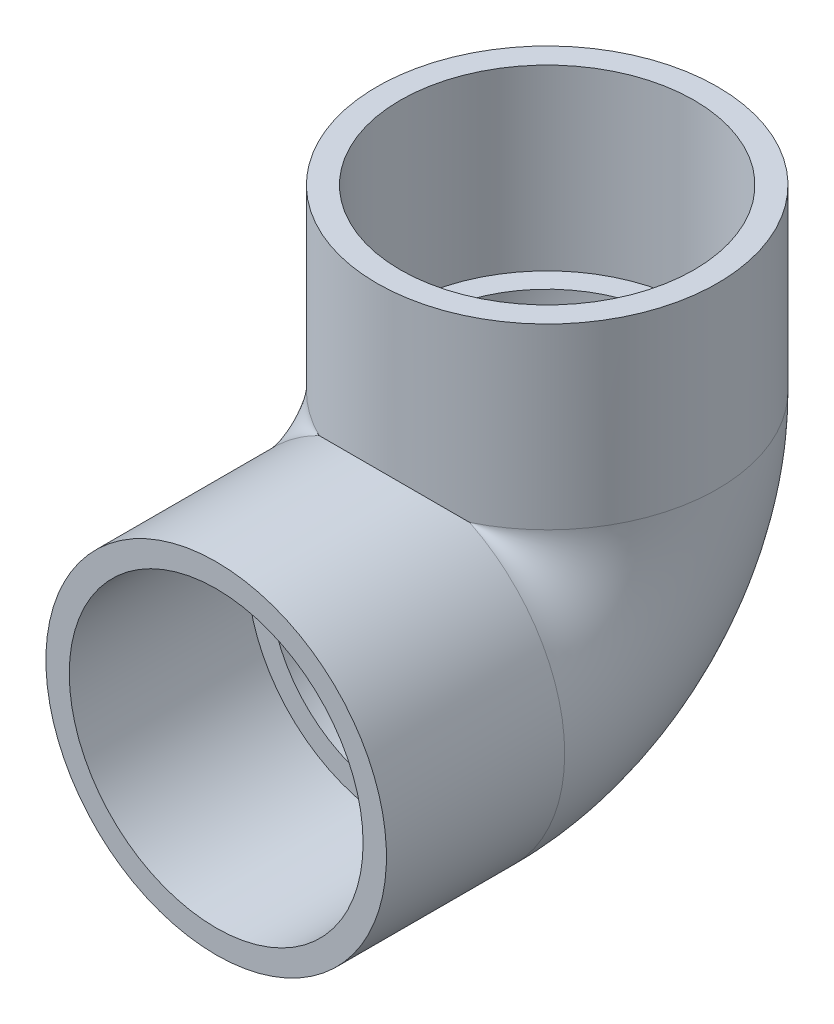
ISO-10303-21;
HEADER;
FILE_DESCRIPTION(('STEP AP214'),'2;1');
FILE_NAME('part.step','',(''),(''),'','','');
FILE_SCHEMA(('AUTOMOTIVE_DESIGN { 1 0 10303 214 1 1 1 1 }'));
ENDSEC;
DATA;
#1=APPLICATION_CONTEXT('core data for automotive mechanical design processes');
#2=APPLICATION_PROTOCOL_DEFINITION('international standard','automotive_design',2000,#1);
#3=PRODUCT_CONTEXT('',#1,'mechanical');
#4=PRODUCT('Part','Part','',(#3));
#5=PRODUCT_RELATED_PRODUCT_CATEGORY('part','',(#4));
#6=PRODUCT_DEFINITION_FORMATION('','',#4);
#7=PRODUCT_DEFINITION_CONTEXT('part definition',#1,'design');
#8=PRODUCT_DEFINITION('design','',#6,#7);
#9=PRODUCT_DEFINITION_SHAPE('','',#8);
#10=(LENGTH_UNIT() NAMED_UNIT(*) SI_UNIT(.MILLI.,.METRE.));
#11=(NAMED_UNIT(*) PLANE_ANGLE_UNIT() SI_UNIT($,.RADIAN.));
#12=(NAMED_UNIT(*) SI_UNIT($,.STERADIAN.) SOLID_ANGLE_UNIT());
#13=UNCERTAINTY_MEASURE_WITH_UNIT(LENGTH_MEASURE(1.E-05),#10,'distance_accuracy_value','');
#14=(GEOMETRIC_REPRESENTATION_CONTEXT(3) GLOBAL_UNCERTAINTY_ASSIGNED_CONTEXT((#13)) GLOBAL_UNIT_ASSIGNED_CONTEXT((#10,
#11,#12)) REPRESENTATION_CONTEXT('',''));
#15=CARTESIAN_POINT('',(0.,0.,0.));
#16=DIRECTION('',(0.,0.,1.));
#17=DIRECTION('',(1.,0.,0.));
#18=AXIS2_PLACEMENT_3D('',#15,#16,#17);
#19=CARTESIAN_POINT('',(0.,36.6395,82.55));
#20=DIRECTION('',(0.,0.,1.));
#21=DIRECTION('',(0.,-1.,0.));
#22=AXIS2_PLACEMENT_3D('',#19,#20,#21);
#23=PLANE('',#22);
#24=CARTESIAN_POINT('',(0.,0.,82.55));
#25=DIRECTION('',(0.,0.,-1.));
#26=DIRECTION('',(0.,1.,0.));
#27=AXIS2_PLACEMENT_3D('',#24,#25,#26);
#28=CIRCLE('',#27,36.6395);
#29=CARTESIAN_POINT('',(0.,36.6395,82.55));
#30=VERTEX_POINT('',#29);
#31=EDGE_CURVE('E127',#30,#30,#28,.T.);
#32=ORIENTED_EDGE('',*,*,#31,.T.);
#33=EDGE_LOOP('',(#32));
#34=FACE_BOUND('',#33,.T.);
#35=CARTESIAN_POINT('',(0.,0.,82.55));
#36=DIRECTION('',(0.,0.,-1.));
#37=DIRECTION('',(0.,1.,0.));
#38=AXIS2_PLACEMENT_3D('',#35,#36,#37);
#39=CIRCLE('',#38,42.465625);
#40=CARTESIAN_POINT('',(0.,42.465625,82.55));
#41=VERTEX_POINT('',#40);
#42=EDGE_CURVE('E11',#41,#41,#39,.T.);
#43=ORIENTED_EDGE('',*,*,#42,.F.);
#44=EDGE_LOOP('',(#43));
#45=FACE_BOUND('',#44,.T.);
#46=ADVANCED_FACE('F36',(#34,#45),#23,.T.);
#47=CARTESIAN_POINT('',(0.,0.,0.));
#48=DIRECTION('',(0.,0.,-1.));
#49=DIRECTION('',(0.,1.,0.));
#50=AXIS2_PLACEMENT_3D('',#47,#48,#49);
#51=CYLINDRICAL_SURFACE('',#50,42.465625);
#52=CARTESIAN_POINT('',(0.,0.,0.));
#53=DIRECTION('',(0.,0.707106781186548,-0.707106781186547));
#54=DIRECTION('',(0.,-0.707106781186547,-0.707106781186548));
#55=AXIS2_PLACEMENT_3D('',#52,#53,#54);
#56=ELLIPSE('',#55,60.05546280965,42.465625);
#57=CARTESIAN_POINT('',(-18.7541810442531,38.1,38.1000000000001));
#58=VERTEX_POINT('',#57);
#59=CARTESIAN_POINT('',(18.7541810442531,38.1,38.1000000000001));
#60=VERTEX_POINT('',#59);
#61=EDGE_CURVE('E119',#58,#60,#56,.T.);
#62=ORIENTED_EDGE('',*,*,#61,.F.);
#63=CARTESIAN_POINT('',(18.7541810442531,38.1,38.1000000000001));
#64=CARTESIAN_POINT('',(19.2868259236087,37.8378219201593,38.1000000000001));
#65=CARTESIAN_POINT('',(19.8139654230355,37.5644606954622,38.1000000000001));
#66=CARTESIAN_POINT('',(20.8563231035043,36.9958830385261,38.1000000000001));
#67=CARTESIAN_POINT('',(21.3715412845463,36.7006666062871,38.1000000000001));
#68=CARTESIAN_POINT('',(22.3891457697179,36.0888896164379,38.1000000000001));
#69=CARTESIAN_POINT('',(22.8915320738475,35.7723290588276,38.1000000000001));
#70=CARTESIAN_POINT('',(23.8825904323408,35.1184227381352,38.1000000000001));
#71=CARTESIAN_POINT('',(24.3712624867045,34.7810769750529,38.1000000000001));
#72=CARTESIAN_POINT('',(25.3340325871102,34.0861929591293,38.1000000000001));
#73=CARTESIAN_POINT('',(25.8081306331522,33.7286547062878,38.1000000000001));
#74=CARTESIAN_POINT('',(26.7409189934002,32.9940146790764,38.1000000000001));
#75=CARTESIAN_POINT('',(27.1996093076062,32.6169129047065,38.1000000000001));
#76=CARTESIAN_POINT('',(28.1007754705758,31.8438090114148,38.1000000000001));
#77=CARTESIAN_POINT('',(28.5432513193393,31.447806892493,38.1000000000001));
#78=CARTESIAN_POINT('',(29.4112103635852,30.6375987806999,38.1000000000001));
#79=CARTESIAN_POINT('',(29.8366935590675,30.2233927878284,38.1000000000001));
#80=CARTESIAN_POINT('',(30.6699189865806,29.3775054001462,38.1000000000001));
#81=CARTESIAN_POINT('',(31.0776612186114,28.9458240053353,38.1000000000001));
#82=CARTESIAN_POINT('',(31.8746876126311,28.0657450240473,38.1000000000001));
#83=CARTESIAN_POINT('',(32.26397177462,27.61734743757,38.1000000000001));
#84=CARTESIAN_POINT('',(33.0233973841036,26.7046246814082,38.1000000000001));
#85=CARTESIAN_POINT('',(33.3935388315984,26.2402995117236,38.1000000000001));
#86=CARTESIAN_POINT('',(34.1140280345882,25.2965382101413,38.1000000000001));
#87=CARTESIAN_POINT('',(34.4643757900833,24.8171020782435,38.1000000000001));
#88=CARTESIAN_POINT('',(35.1446614432169,23.8439620492036,38.1000000000001));
#89=CARTESIAN_POINT('',(35.4745993408555,23.3502581520615,38.1000000000001));
#90=CARTESIAN_POINT('',(36.113485007786,22.349450882617,38.1000000000001));
#91=CARTESIAN_POINT('',(36.422432777078,21.8423475103147,38.1000000000001));
#92=CARTESIAN_POINT('',(37.0187948327152,20.8156331466392,38.1000000000001));
#93=CARTESIAN_POINT('',(37.3062091190604,20.2960221552661,38.1000000000001));
#94=CARTESIAN_POINT('',(37.85899872571,19.2452064070201,38.1000000000001));
#95=CARTESIAN_POINT('',(38.1243740460143,18.7140016501472,38.1000000000001));
#96=CARTESIAN_POINT('',(38.6326189979989,17.6409326147336,38.1000000000001));
#97=CARTESIAN_POINT('',(38.8754886296793,17.0990683361928,38.1000000000001));
#98=CARTESIAN_POINT('',(39.3382950631821,16.0056332484579,38.1000000000001));
#99=CARTESIAN_POINT('',(39.5582318650045,15.4540624392637,38.1000000000001));
#100=CARTESIAN_POINT('',(39.9747858301307,14.3421843523678,38.1000000000001));
#101=CARTESIAN_POINT('',(40.1714029934344,13.7818770746662,38.1000000000001));
#102=CARTESIAN_POINT('',(40.5409718857265,12.6535114779594,38.1000000000001));
#103=CARTESIAN_POINT('',(40.7139236147149,12.0854531589542,38.1000000000001));
#104=CARTESIAN_POINT('',(41.0358574636039,10.9425845388054,38.1000000000001));
#105=CARTESIAN_POINT('',(41.1848395835045,10.3677742376616,38.1000000000001));
#106=CARTESIAN_POINT('',(41.4585721954298,9.21241258728972,38.1000000000001));
#107=CARTESIAN_POINT('',(41.5833226874545,8.63186123806158,38.1000000000001));
#108=CARTESIAN_POINT('',(41.8083726416438,7.46603852250792,38.1000000000001));
#109=CARTESIAN_POINT('',(41.9086721038083,6.8807671561824,38.1000000000001));
#110=CARTESIAN_POINT('',(42.0846435989648,5.70653373863974,38.1000000000001));
#111=CARTESIAN_POINT('',(42.1603156319567,5.1175716874226,38.1000000000001));
#112=CARTESIAN_POINT('',(42.2868991823654,3.93699272320739,38.1000000000001));
#113=CARTESIAN_POINT('',(42.3378106997821,3.34537581020933,38.1000000000001));
#114=CARTESIAN_POINT('',(42.4147836796106,2.16052761471852,38.1000000000001));
#115=CARTESIAN_POINT('',(42.4408451420222,1.56729633222577,38.1000000000001));
#116=CARTESIAN_POINT('',(42.4680721768584,0.380262729266048,38.1000000000001));
#117=CARTESIAN_POINT('',(42.4692377492828,-0.213539591200917,38.1000000000001));
#118=CARTESIAN_POINT('',(42.4466709542216,-1.40067093428902,38.1000000000001));
#119=CARTESIAN_POINT('',(42.4229385867359,-1.99399995691016,38.1000000000001));
#120=CARTESIAN_POINT('',(42.3506176505956,-3.17914120088798,38.1000000000001));
#121=CARTESIAN_POINT('',(42.302029081941,-3.77095342224467,38.1000000000001));
#122=CARTESIAN_POINT('',(42.1800811974616,-4.95202022791339,38.1000000000001));
#123=CARTESIAN_POINT('',(42.1067218816369,-5.54127481222543,38.1000000000001));
#124=CARTESIAN_POINT('',(41.9353615217829,-6.71619000620847,38.1000000000001));
#125=CARTESIAN_POINT('',(41.8373604777536,-7.30185061587948,38.1000000000001));
#126=CARTESIAN_POINT('',(41.6168890185145,-8.46854784380217,38.1000000000001));
#127=CARTESIAN_POINT('',(41.4944186033046,-9.04958446205385,38.1000000000001));
#128=CARTESIAN_POINT('',(41.2252237936572,-10.2060118226954,38.1000000000001));
#129=CARTESIAN_POINT('',(41.0784993992197,-10.7814025650853,38.1000000000001));
#130=CARTESIAN_POINT('',(40.7610546791837,-11.9255262191117,38.1000000000001));
#131=CARTESIAN_POINT('',(40.5903343535851,-12.4942591307482,38.1000000000001));
#132=CARTESIAN_POINT('',(40.2251980215716,-13.6240668776792,38.1000000000001));
#133=CARTESIAN_POINT('',(40.0307820151565,-14.1851417129736,38.1000000000001));
#134=CARTESIAN_POINT('',(39.6185962460737,-15.2986465300925,38.1000000000001));
#135=CARTESIAN_POINT('',(39.400826483406,-15.8510765119171,38.1000000000001));
#136=CARTESIAN_POINT('',(38.9423161992497,-16.9463200489007,38.1000000000001));
#137=CARTESIAN_POINT('',(38.7015756777611,-17.4891336040598,38.1000000000001));
#138=CARTESIAN_POINT('',(38.1975472726747,-18.5641896271802,38.1000000000001));
#139=CARTESIAN_POINT('',(37.9342593890769,-19.0964320951416,38.1000000000001));
#140=CARTESIAN_POINT('',(37.385599311125,-20.1494098749847,38.1000000000001));
#141=CARTESIAN_POINT('',(37.1002271167709,-20.6701451868664,38.1000000000001));
#142=CARTESIAN_POINT('',(36.5079003089197,-21.6991928236075,38.1000000000001));
#143=CARTESIAN_POINT('',(36.2009456954226,-22.2075051484668,38.1000000000001));
#144=CARTESIAN_POINT('',(35.5659938984692,-23.2108128288556,38.1000000000001));
#145=CARTESIAN_POINT('',(35.2379967150129,-23.7058081843851,38.1000000000001));
#146=CARTESIAN_POINT('',(34.5615366354481,-24.6816113647123,38.1000000000001));
#147=CARTESIAN_POINT('',(34.2130737393397,-25.1624191895101,38.1000000000001));
#148=CARTESIAN_POINT('',(33.4962950853671,-26.1090016989569,38.1000000000001));
#149=CARTESIAN_POINT('',(33.1279793275029,-26.574776383606,38.1000000000001));
#150=CARTESIAN_POINT('',(32.3721427166673,-27.4904734425191,38.1000000000001));
#151=CARTESIAN_POINT('',(31.9846218636959,-27.9403958167831,38.1000000000001));
#152=CARTESIAN_POINT('',(31.1910566058023,-28.8235969645664,38.1000000000001));
#153=CARTESIAN_POINT('',(30.78501220088,-29.2568757380857,38.1000000000001));
#154=CARTESIAN_POINT('',(29.9551139601011,-30.1060276655602,38.1000000000001));
#155=CARTESIAN_POINT('',(29.5312601242445,-30.5219008195153,38.1000000000001));
#156=CARTESIAN_POINT('',(28.6664884645294,-31.3355101007647,38.1000000000001));
#157=CARTESIAN_POINT('',(28.225570640671,-31.7332462280589,38.1000000000001));
#158=CARTESIAN_POINT('',(27.3274464587715,-32.5098819469573,38.1000000000001));
#159=CARTESIAN_POINT('',(26.8702401007304,-32.8887815385615,38.1000000000001));
#160=CARTESIAN_POINT('',(25.9403429513596,-33.6270778053634,38.1000000000001));
#161=CARTESIAN_POINT('',(25.46765216003,-33.9864744805612,38.1000000000001));
#162=CARTESIAN_POINT('',(24.5076174778581,-34.685132834128,38.1000000000001));
#163=CARTESIAN_POINT('',(24.0202735870159,-35.024394512497,38.1000000000001));
#164=CARTESIAN_POINT('',(23.0317898103876,-35.6821862039344,38.1000000000001));
#165=CARTESIAN_POINT('',(22.5306499246015,-36.0007162170029,38.1000000000001));
#166=CARTESIAN_POINT('',(21.5154555260351,-36.6164843706946,38.1000000000001));
#167=CARTESIAN_POINT('',(21.0014010132548,-36.9137225113179,38.1000000000001));
#168=CARTESIAN_POINT('',(19.9612814419448,-37.4863841595531,38.1000000000001));
#169=CARTESIAN_POINT('',(19.4352163834151,-37.7618076671649,38.1000000000001));
#170=CARTESIAN_POINT('',(18.3720009251153,-38.2903556547818,38.1000000000001));
#171=CARTESIAN_POINT('',(17.8348505253452,-38.5434801347869,38.1000000000001));
#172=CARTESIAN_POINT('',(16.7504090851558,-39.0269848904838,38.1000000000001));
#173=CARTESIAN_POINT('',(16.2031180447366,-39.2573651661755,38.1000000000001));
#174=CARTESIAN_POINT('',(15.0993578584525,-39.6949763373718,38.1000000000001));
#175=CARTESIAN_POINT('',(14.5428887125878,-39.9022072328763,38.1000000000001));
#176=CARTESIAN_POINT('',(13.421750992393,-40.2931551812503,38.1000000000001));
#177=CARTESIAN_POINT('',(12.8570824180629,-40.4768722341198,38.1000000000001));
#178=CARTESIAN_POINT('',(11.7205389384688,-40.820469389192,38.1000000000001));
#179=CARTESIAN_POINT('',(11.1486640332048,-40.9803494913946,38.1000000000001));
#180=CARTESIAN_POINT('',(9.99871366323885,-41.2759915597758,38.1000000000001));
#181=CARTESIAN_POINT('',(9.4206381985369,-41.4117535259543,38.1000000000001));
#182=CARTESIAN_POINT('',(8.2593033862786,-41.6589205541325,38.1000000000001));
#183=CARTESIAN_POINT('',(7.67604403872224,-41.7703256161323,38.1000000000001));
#184=CARTESIAN_POINT('',(6.50536725437033,-41.9685829049289,38.1000000000001));
#185=CARTESIAN_POINT('',(5.91794981757478,-42.0554351317257,38.1000000000001));
#186=CARTESIAN_POINT('',(4.739989961301,-42.2044340008119,38.1000000000001));
#187=CARTESIAN_POINT('',(4.14944754182278,-42.2665806431013,38.1000000000001));
#188=CARTESIAN_POINT('',(2.96627632272978,-42.3660590442318,38.1000000000001));
#189=CARTESIAN_POINT('',(2.373647523115,-42.4033908030729,38.1000000000001));
#190=CARTESIAN_POINT('',(1.1873458156668,-42.4531737809571,38.1000000000001));
#191=CARTESIAN_POINT('',(0.593672907833391,-42.465625,38.1000000000001));
#192=CARTESIAN_POINT('',(-0.593672907833429,-42.465625,38.1000000000001));
#193=CARTESIAN_POINT('',(-1.18734581566684,-42.453173780957,38.1000000000001));
#194=CARTESIAN_POINT('',(-2.37364752311503,-42.4033908030729,38.1000000000001));
#195=CARTESIAN_POINT('',(-2.96627632272982,-42.3660590442318,38.1000000000001));
#196=CARTESIAN_POINT('',(-4.14944754182282,-42.2665806431013,38.1000000000001));
#197=CARTESIAN_POINT('',(-4.73998996130104,-42.2044340008119,38.1000000000001));
#198=CARTESIAN_POINT('',(-5.91794981757481,-42.0554351317257,38.1000000000001));
#199=CARTESIAN_POINT('',(-6.50536725437037,-41.9685829049289,38.1000000000001));
#200=CARTESIAN_POINT('',(-7.67604403872228,-41.7703256161323,38.1000000000001));
#201=CARTESIAN_POINT('',(-8.25930338627863,-41.6589205541325,38.1000000000001));
#202=CARTESIAN_POINT('',(-9.42063819853693,-41.4117535259543,38.1000000000001));
#203=CARTESIAN_POINT('',(-9.99871366323889,-41.2759915597758,38.1000000000001));
#204=CARTESIAN_POINT('',(-11.1486640332048,-40.9803494913946,38.1000000000001));
#205=CARTESIAN_POINT('',(-11.7205389384688,-40.8204693891919,38.1000000000001));
#206=CARTESIAN_POINT('',(-12.8570824180629,-40.4768722341198,38.1000000000001));
#207=CARTESIAN_POINT('',(-13.421750992393,-40.2931551812503,38.1000000000001));
#208=CARTESIAN_POINT('',(-14.5428887125878,-39.9022072328763,38.1000000000001));
#209=CARTESIAN_POINT('',(-15.0993578584526,-39.6949763373718,38.1000000000001));
#210=CARTESIAN_POINT('',(-16.2031180447366,-39.2573651661755,38.1000000000001));
#211=CARTESIAN_POINT('',(-16.7504090851559,-39.0269848904838,38.1000000000001));
#212=CARTESIAN_POINT('',(-17.8348505253453,-38.5434801347869,38.1000000000001));
#213=CARTESIAN_POINT('',(-18.3720009251154,-38.2903556547818,38.1000000000001));
#214=CARTESIAN_POINT('',(-19.4352163834151,-37.7618076671649,38.1000000000001));
#215=CARTESIAN_POINT('',(-19.9612814419448,-37.4863841595531,38.1000000000001));
#216=CARTESIAN_POINT('',(-21.0014010132548,-36.9137225113179,38.1000000000001));
#217=CARTESIAN_POINT('',(-21.5154555260352,-36.6164843706946,38.1000000000001));
#218=CARTESIAN_POINT('',(-22.5306499246015,-36.0007162170029,38.1000000000001));
#219=CARTESIAN_POINT('',(-23.0317898103876,-35.6821862039344,38.1000000000001));
#220=CARTESIAN_POINT('',(-24.0202735870159,-35.024394512497,38.1000000000001));
#221=CARTESIAN_POINT('',(-24.5076174778582,-34.6851328341279,38.1000000000001));
#222=CARTESIAN_POINT('',(-25.46765216003,-33.9864744805612,38.1000000000001));
#223=CARTESIAN_POINT('',(-25.9403429513597,-33.6270778053634,38.1000000000001));
#224=CARTESIAN_POINT('',(-26.8702401007304,-32.8887815385615,38.1000000000001));
#225=CARTESIAN_POINT('',(-27.3274464587715,-32.5098819469573,38.1000000000001));
#226=CARTESIAN_POINT('',(-28.225570640671,-31.7332462280589,38.1000000000001));
#227=CARTESIAN_POINT('',(-28.6664884645294,-31.3355101007647,38.1000000000001));
#228=CARTESIAN_POINT('',(-29.5312601242445,-30.5219008195153,38.1000000000001));
#229=CARTESIAN_POINT('',(-29.9551139601012,-30.1060276655601,38.1000000000001));
#230=CARTESIAN_POINT('',(-30.7850122008801,-29.2568757380857,38.1000000000001));
#231=CARTESIAN_POINT('',(-31.1910566058023,-28.8235969645663,38.1000000000001));
#232=CARTESIAN_POINT('',(-31.9846218636959,-27.940395816783,38.1000000000001));
#233=CARTESIAN_POINT('',(-32.3721427166673,-27.4904734425191,38.1000000000001));
#234=CARTESIAN_POINT('',(-33.1279793275029,-26.574776383606,38.1000000000001));
#235=CARTESIAN_POINT('',(-33.4962950853671,-26.1090016989569,38.1000000000001));
#236=CARTESIAN_POINT('',(-34.2130737393397,-25.16241918951,38.1000000000001));
#237=CARTESIAN_POINT('',(-34.5615366354482,-24.6816113647123,38.1000000000001));
#238=CARTESIAN_POINT('',(-35.2379967150129,-23.7058081843851,38.1000000000001));
#239=CARTESIAN_POINT('',(-35.5659938984693,-23.2108128288556,38.1000000000001));
#240=CARTESIAN_POINT('',(-36.2009456954227,-22.2075051484668,38.1000000000001));
#241=CARTESIAN_POINT('',(-36.5079003089197,-21.6991928236075,38.1000000000001));
#242=CARTESIAN_POINT('',(-37.1002271167709,-20.6701451868664,38.1000000000001));
#243=CARTESIAN_POINT('',(-37.385599311125,-20.1494098749847,38.1000000000001));
#244=CARTESIAN_POINT('',(-37.9342593890769,-19.0964320951416,38.1000000000001));
#245=CARTESIAN_POINT('',(-38.1975472726747,-18.5641896271802,38.1000000000001));
#246=CARTESIAN_POINT('',(-38.7015756777611,-17.4891336040597,38.1000000000001));
#247=CARTESIAN_POINT('',(-38.9423161992497,-16.9463200489007,38.1000000000001));
#248=CARTESIAN_POINT('',(-39.400826483406,-15.8510765119171,38.1000000000001));
#249=CARTESIAN_POINT('',(-39.6185962460737,-15.2986465300925,38.1000000000001));
#250=CARTESIAN_POINT('',(-40.0307820151565,-14.1851417129735,38.1000000000001));
#251=CARTESIAN_POINT('',(-40.2251980215716,-13.6240668776791,38.1000000000001));
#252=CARTESIAN_POINT('',(-40.5903343535852,-12.4942591307482,38.1000000000001));
#253=CARTESIAN_POINT('',(-40.7610546791837,-11.9255262191116,38.1000000000001));
#254=CARTESIAN_POINT('',(-41.0784993992197,-10.7814025650852,38.1000000000001));
#255=CARTESIAN_POINT('',(-41.2252237936572,-10.2060118226954,38.1000000000001));
#256=CARTESIAN_POINT('',(-41.4944186033046,-9.0495844620538,38.1000000000001));
#257=CARTESIAN_POINT('',(-41.6168890185145,-8.46854784380212,38.1000000000001));
#258=CARTESIAN_POINT('',(-41.8373604777536,-7.30185061587943,38.1000000000001));
#259=CARTESIAN_POINT('',(-41.9353615217829,-6.71619000620843,38.1000000000001));
#260=CARTESIAN_POINT('',(-42.1067218816369,-5.54127481222539,38.1000000000001));
#261=CARTESIAN_POINT('',(-42.1800811974616,-4.95202022791335,38.1000000000001));
#262=CARTESIAN_POINT('',(-42.302029081941,-3.77095342224463,38.1000000000001));
#263=CARTESIAN_POINT('',(-42.3506176505956,-3.17914120088795,38.1000000000001));
#264=CARTESIAN_POINT('',(-42.4229385867359,-1.99399995691012,38.1000000000001));
#265=CARTESIAN_POINT('',(-42.4466709542216,-1.40067093428899,38.1000000000001));
#266=CARTESIAN_POINT('',(-42.4692377492828,-0.213539591200877,38.1000000000001));
#267=CARTESIAN_POINT('',(-42.4680721768584,0.380262729266092,38.1000000000001));
#268=CARTESIAN_POINT('',(-42.4408451420222,1.56729633222581,38.1000000000001));
#269=CARTESIAN_POINT('',(-42.4147836796106,2.16052761471857,38.1000000000001));
#270=CARTESIAN_POINT('',(-42.3378106997821,3.34537581020938,38.1000000000001));
#271=CARTESIAN_POINT('',(-42.2868991823653,3.93699272320744,38.1000000000001));
#272=CARTESIAN_POINT('',(-42.1603156319567,5.11757168742264,38.1000000000001));
#273=CARTESIAN_POINT('',(-42.0846435989648,5.70653373863978,38.1000000000001));
#274=CARTESIAN_POINT('',(-41.9086721038083,6.88076715618243,38.1000000000001));
#275=CARTESIAN_POINT('',(-41.8083726416438,7.46603852250794,38.1000000000001));
#276=CARTESIAN_POINT('',(-41.5833226874545,8.6318612380616,38.1000000000001));
#277=CARTESIAN_POINT('',(-41.4585721954298,9.21241258728975,38.1000000000001));
#278=CARTESIAN_POINT('',(-41.1848395835045,10.3677742376616,38.1000000000001));
#279=CARTESIAN_POINT('',(-41.0358574636039,10.9425845388054,38.1000000000001));
#280=CARTESIAN_POINT('',(-40.7139236147149,12.0854531589543,38.1000000000001));
#281=CARTESIAN_POINT('',(-40.5409718857265,12.6535114779594,38.1000000000001));
#282=CARTESIAN_POINT('',(-40.1714029934344,13.7818770746662,38.1000000000001));
#283=CARTESIAN_POINT('',(-39.9747858301306,14.3421843523679,38.1000000000001));
#284=CARTESIAN_POINT('',(-39.5582318650045,15.4540624392637,38.1000000000001));
#285=CARTESIAN_POINT('',(-39.3382950631821,16.0056332484579,38.1000000000001));
#286=CARTESIAN_POINT('',(-38.8754886296793,17.0990683361929,38.1000000000001));
#287=CARTESIAN_POINT('',(-38.6326189979989,17.6409326147336,38.1000000000001));
#288=CARTESIAN_POINT('',(-38.1243740460143,18.7140016501473,38.1000000000001));
#289=CARTESIAN_POINT('',(-37.8589987257099,19.2452064070202,38.1000000000001));
#290=CARTESIAN_POINT('',(-37.3062091190604,20.2960221552662,38.1000000000001));
#291=CARTESIAN_POINT('',(-37.0187948327152,20.8156331466393,38.1000000000001));
#292=CARTESIAN_POINT('',(-36.422432777078,21.8423475103147,38.1000000000001));
#293=CARTESIAN_POINT('',(-36.113485007786,22.3494508826171,38.1000000000001));
#294=CARTESIAN_POINT('',(-35.4745993408555,23.3502581520616,38.1000000000001));
#295=CARTESIAN_POINT('',(-35.1446614432169,23.8439620492037,38.1000000000001));
#296=CARTESIAN_POINT('',(-34.4643757900833,24.8171020782436,38.1000000000001));
#297=CARTESIAN_POINT('',(-34.1140280345882,25.2965382101413,38.1000000000001));
#298=CARTESIAN_POINT('',(-33.3935388315984,26.2402995117237,38.1000000000001));
#299=CARTESIAN_POINT('',(-33.0233973841036,26.7046246814082,38.1000000000001));
#300=CARTESIAN_POINT('',(-32.2639717746199,27.61734743757,38.1000000000001));
#301=CARTESIAN_POINT('',(-31.874687612631,28.0657450240473,38.1000000000001));
#302=CARTESIAN_POINT('',(-31.0776612186114,28.9458240053354,38.1000000000001));
#303=CARTESIAN_POINT('',(-30.6699189865806,29.3775054001462,38.1000000000001));
#304=CARTESIAN_POINT('',(-29.8366935590675,30.2233927878284,38.1000000000001));
#305=CARTESIAN_POINT('',(-29.4112103635852,30.6375987806999,38.1000000000001));
#306=CARTESIAN_POINT('',(-28.5432513193393,31.4478068924931,38.1000000000001));
#307=CARTESIAN_POINT('',(-28.1007754705757,31.8438090114148,38.1000000000001));
#308=CARTESIAN_POINT('',(-27.1996093076062,32.6169129047065,38.1000000000001));
#309=CARTESIAN_POINT('',(-26.7409189934002,32.9940146790765,38.1000000000001));
#310=CARTESIAN_POINT('',(-25.8081306331522,33.7286547062878,38.1000000000001));
#311=CARTESIAN_POINT('',(-25.3340325871101,34.0861929591293,38.1000000000001));
#312=CARTESIAN_POINT('',(-24.3712624867044,34.781076975053,38.1000000000001));
#313=CARTESIAN_POINT('',(-23.8825904323408,35.1184227381352,38.1000000000001));
#314=CARTESIAN_POINT('',(-22.8915320738475,35.7723290588277,38.1000000000001));
#315=CARTESIAN_POINT('',(-22.3891457697179,36.0888896164379,38.1000000000001));
#316=CARTESIAN_POINT('',(-21.3715412845463,36.7006666062872,38.1000000000001));
#317=CARTESIAN_POINT('',(-20.8563231035043,36.9958830385262,38.1000000000001));
#318=CARTESIAN_POINT('',(-19.8139654230355,37.5644606954622,38.1000000000001));
#319=CARTESIAN_POINT('',(-19.2868259236086,37.8378219201593,38.1000000000001));
#320=CARTESIAN_POINT('',(-18.7541810442531,38.1,38.1000000000001));
#321=B_SPLINE_CURVE_WITH_KNOTS('',3,(#63,#64,#65,#66,#67,#68,#69,#70,#71,#72,#73,#74,#75,#76,
#77,#78,#79,#80,#81,#82,#83,#84,#85,#86,#87,#88,#89,#90,#91,#92,#93,#94,#95,#96,#97,#98,#99,
#100,#101,#102,#103,#104,#105,#106,#107,#108,#109,#110,#111,#112,#113,#114,#115,#116,#117,#118,
#119,#120,#121,#122,#123,#124,#125,#126,#127,#128,#129,#130,#131,#132,#133,#134,#135,#136,#137,
#138,#139,#140,#141,#142,#143,#144,#145,#146,#147,#148,#149,#150,#151,#152,#153,#154,#155,#156,
#157,#158,#159,#160,#161,#162,#163,#164,#165,#166,#167,#168,#169,#170,#171,#172,#173,#174,#175,
#176,#177,#178,#179,#180,#181,#182,#183,#184,#185,#186,#187,#188,#189,#190,#191,#192,#193,#194,
#195,#196,#197,#198,#199,#200,#201,#202,#203,#204,#205,#206,#207,#208,#209,#210,#211,#212,#213,
#214,#215,#216,#217,#218,#219,#220,#221,#222,#223,#224,#225,#226,#227,#228,#229,#230,#231,#232,
#233,#234,#235,#236,#237,#238,#239,#240,#241,#242,#243,#244,#245,#246,#247,#248,#249,#250,#251,
#252,#253,#254,#255,#256,#257,#258,#259,#260,#261,#262,#263,#264,#265,#266,#267,#268,#269,#270,
#271,#272,#273,#274,#275,#276,#277,#278,#279,#280,#281,#282,#283,#284,#285,#286,#287,#288,#289,
#290,#291,#292,#293,#294,#295,#296,#297,#298,#299,#300,#301,#302,#303,#304,#305,#306,#307,#308,
#309,#310,#311,#312,#313,#314,#315,#316,#317,#318,#319,#320),.UNSPECIFIED.,.F.,.F.,(4,2,2,2,2,2,
2,2,2,2,2,2,2,2,2,2,2,2,2,2,2,2,2,2,2,2,2,2,2,2,2,2,2,2,2,2,2,2,2,2,2,2,2,2,2,2,2,2,2,2,2,2,2,2,
2,2,2,2,2,2,2,2,2,2,2,2,2,2,2,2,2,2,2,2,2,2,2,2,2,2,2,2,2,2,2,2,2,2,2,2,2,2,2,2,2,2,2,2,2,2,2,2,
2,2,2,2,2,2,2,2,2,2,2,2,2,2,2,2,2,2,2,2,2,2,2,2,2,2,4),(0.,1.78088822432847,3.56177644865693,
5.3426646729854,7.12355289731387,8.90444112164234,10.6853293459708,12.4662175702993,
14.2471057946277,16.0279940189562,17.8088822432846,19.5897704676131,21.3706586919416,
23.15154691627,24.9324351405985,26.713323364927,28.4942115892554,30.2750998135839,
32.0559880379124,33.8368762622408,35.6177644865693,37.3986527108978,39.1795409352262,
40.9604291595547,42.7413173838832,44.5222056082116,46.3030938325401,48.0839820568685,
49.864870281197,51.6457585055255,53.4266467298539,55.2075349541824,56.9884231785109,
58.7693114028393,60.5501996271678,62.3310878514963,64.1119760758247,65.8928643001532,
67.6737525244817,69.4546407488101,71.2355289731386,73.0164171974671,74.7973054217955,
76.578193646124,78.3590818704525,80.1399700947809,81.9208583191094,83.7017465434379,
85.4826347677663,87.2635229920948,89.0444112164233,90.8252994407517,92.6061876650802,
94.3870758894087,96.1679641137371,97.9488523380656,99.7297405623941,101.510628786723,
103.291517011051,105.072405235379,106.853293459708,108.634181684036,110.415069908365,
112.195958132693,113.976846357022,115.75773458135,117.538622805679,119.319511030007,
121.100399254336,122.881287478664,124.662175702993,126.443063927321,128.223952151649,
130.004840375978,131.785728600306,133.566616824635,135.347505048963,137.128393273292,
138.90928149762,140.690169721949,142.471057946277,144.251946170606,146.032834394934,
147.813722619263,149.594610843591,151.37549906792,153.156387292248,154.937275516576,
156.718163740905,158.499051965233,160.279940189562,162.06082841389,163.841716638219,
165.622604862547,167.403493086876,169.184381311204,170.965269535533,172.746157759861,
174.52704598419,176.307934208518,178.088822432846,179.869710657175,181.650598881503,
183.431487105832,185.21237533016,186.993263554489,188.774151778817,190.555040003146,
192.335928227474,194.116816451803,195.897704676131,197.67859290046,199.459481124788,
201.240369349117,203.021257573445,204.802145797774,206.583034022102,208.36392224643,
210.144810470759,211.925698695087,213.706586919416,215.487475143744,217.268363368073,
219.049251592401,220.83013981673,222.611028041058,224.391916265387,226.172804489715,
227.953692714044),.UNSPECIFIED.);
#322=EDGE_CURVE('E44',#60,#58,#321,.T.);
#323=ORIENTED_EDGE('',*,*,#322,.F.);
#324=EDGE_LOOP('',(#62,#323));
#325=FACE_BOUND('',#324,.T.);
#326=ORIENTED_EDGE('',*,*,#42,.T.);
#327=EDGE_LOOP('',(#326));
#328=FACE_BOUND('',#327,.T.);
#329=ADVANCED_FACE('F109',(#325,#328),#51,.T.);
#330=CARTESIAN_POINT('',(0.,0.,0.));
#331=DIRECTION('',(0.,0.,-1.));
#332=DIRECTION('',(0.,1.,0.));
#333=AXIS2_PLACEMENT_3D('',#330,#331,#332);
#334=CYLINDRICAL_SURFACE('',#333,36.6395);
#335=CARTESIAN_POINT('',(0.,0.,38.1000000000001));
#336=DIRECTION('',(0.,0.,-1.));
#337=DIRECTION('',(0.,1.,0.));
#338=AXIS2_PLACEMENT_3D('',#335,#336,#337);
#339=CIRCLE('',#338,36.6395);
#340=CARTESIAN_POINT('',(0.,36.6395,38.1000000000001));
#341=VERTEX_POINT('',#340);
#342=EDGE_CURVE('E67',#341,#341,#339,.T.);
#343=ORIENTED_EDGE('',*,*,#342,.T.);
#344=EDGE_LOOP('',(#343));
#345=FACE_BOUND('',#344,.T.);
#346=ORIENTED_EDGE('',*,*,#31,.F.);
#347=EDGE_LOOP('',(#346));
#348=FACE_BOUND('',#347,.T.);
#349=ADVANCED_FACE('F106',(#345,#348),#334,.F.);
#350=CARTESIAN_POINT('',(0.,82.55,-36.6395));
#351=DIRECTION('',(0.,1.,0.));
#352=DIRECTION('',(0.,0.,1.));
#353=AXIS2_PLACEMENT_3D('',#350,#351,#352);
#354=PLANE('',#353);
#355=CARTESIAN_POINT('',(0.,82.55,0.));
#356=DIRECTION('',(0.,-1.,0.));
#357=DIRECTION('',(0.,0.,-1.));
#358=AXIS2_PLACEMENT_3D('',#355,#356,#357);
#359=CIRCLE('',#358,36.6395);
#360=CARTESIAN_POINT('',(0.,82.55,-36.6395));
#361=VERTEX_POINT('',#360);
#362=EDGE_CURVE('E80',#361,#361,#359,.T.);
#363=ORIENTED_EDGE('',*,*,#362,.T.);
#364=EDGE_LOOP('',(#363));
#365=FACE_BOUND('',#364,.T.);
#366=CARTESIAN_POINT('',(0.,82.55,0.));
#367=DIRECTION('',(0.,-1.,0.));
#368=DIRECTION('',(0.,0.,-1.));
#369=AXIS2_PLACEMENT_3D('',#366,#367,#368);
#370=CIRCLE('',#369,42.465625);
#371=CARTESIAN_POINT('',(0.,82.55,-42.465625));
#372=VERTEX_POINT('',#371);
#373=EDGE_CURVE('E128',#372,#372,#370,.T.);
#374=ORIENTED_EDGE('',*,*,#373,.F.);
#375=EDGE_LOOP('',(#374));
#376=FACE_BOUND('',#375,.T.);
#377=ADVANCED_FACE('F102',(#365,#376),#354,.T.);
#378=CARTESIAN_POINT('',(0.,0.,0.));
#379=DIRECTION('',(0.,-1.,0.));
#380=DIRECTION('',(0.,0.,-1.));
#381=AXIS2_PLACEMENT_3D('',#378,#379,#380);
#382=CYLINDRICAL_SURFACE('',#381,42.465625);
#383=ORIENTED_EDGE('',*,*,#373,.T.);
#384=EDGE_LOOP('',(#383));
#385=FACE_BOUND('',#384,.T.);
#386=CARTESIAN_POINT('',(0.,38.1,0.));
#387=DIRECTION('',(0.,-1.,0.));
#388=DIRECTION('',(0.,0.,-1.));
#389=AXIS2_PLACEMENT_3D('',#386,#387,#388);
#390=CIRCLE('',#389,42.465625);
#391=EDGE_CURVE('E51',#58,#60,#390,.T.);
#392=ORIENTED_EDGE('',*,*,#391,.F.);
#393=ORIENTED_EDGE('',*,*,#61,.T.);
#394=EDGE_LOOP('',(#392,#393));
#395=FACE_BOUND('',#394,.T.);
#396=ADVANCED_FACE('F98',(#385,#395),#382,.T.);
#397=CARTESIAN_POINT('',(0.,0.,0.));
#398=DIRECTION('',(0.,-1.,0.));
#399=DIRECTION('',(0.,0.,-1.));
#400=AXIS2_PLACEMENT_3D('',#397,#398,#399);
#401=CYLINDRICAL_SURFACE('',#400,36.6395);
#402=CARTESIAN_POINT('',(0.,38.1,0.));
#403=DIRECTION('',(0.,-1.,0.));
#404=DIRECTION('',(0.,0.,-1.));
#405=AXIS2_PLACEMENT_3D('',#402,#403,#404);
#406=CIRCLE('',#405,36.6395);
#407=CARTESIAN_POINT('',(0.,38.1,-36.6395));
#408=VERTEX_POINT('',#407);
#409=EDGE_CURVE('E71',#408,#408,#406,.T.);
#410=ORIENTED_EDGE('',*,*,#409,.T.);
#411=EDGE_LOOP('',(#410));
#412=FACE_BOUND('',#411,.T.);
#413=ORIENTED_EDGE('',*,*,#362,.F.);
#414=EDGE_LOOP('',(#413));
#415=FACE_BOUND('',#414,.T.);
#416=ADVANCED_FACE('F94',(#412,#415),#401,.F.);
#417=CARTESIAN_POINT('',(0.,38.1000000000001,38.1000000000001));
#418=DIRECTION('',(1.,0.,0.));
#419=DIRECTION('',(0.,0.,-1.));
#420=AXIS2_PLACEMENT_3D('',#417,#418,#419);
#421=TOROIDAL_SURFACE('',#420,38.1000000000001,31.0515);
#422=CARTESIAN_POINT('',(0.,38.1000000000001,0.));
#423=DIRECTION('',(0.,1.,0.));
#424=DIRECTION('',(0.,0.,1.));
#425=AXIS2_PLACEMENT_3D('',#422,#423,#424);
#426=CIRCLE('',#425,31.0515);
#427=CARTESIAN_POINT('',(0.,38.1000000000001,31.0515));
#428=VERTEX_POINT('',#427);
#429=EDGE_CURVE('E63',#428,#428,#426,.F.);
#430=ORIENTED_EDGE('',*,*,#429,.F.);
#431=EDGE_LOOP('',(#430));
#432=FACE_BOUND('',#431,.T.);
#433=CARTESIAN_POINT('',(0.,0.,38.1000000000001));
#434=DIRECTION('',(0.,0.,-1.));
#435=DIRECTION('',(0.,1.,0.));
#436=AXIS2_PLACEMENT_3D('',#433,#434,#435);
#437=CIRCLE('',#436,31.0515);
#438=CARTESIAN_POINT('',(0.,31.0515,38.1000000000001));
#439=VERTEX_POINT('',#438);
#440=EDGE_CURVE('E68',#439,#439,#437,.F.);
#441=ORIENTED_EDGE('',*,*,#440,.T.);
#442=EDGE_LOOP('',(#441));
#443=FACE_BOUND('',#442,.T.);
#444=ADVANCED_FACE('F97',(#432,#443),#421,.F.);
#445=CARTESIAN_POINT('',(0.,0.,38.1000000000001));
#446=DIRECTION('',(0.,0.,-1.));
#447=DIRECTION('',(0.,1.,0.));
#448=AXIS2_PLACEMENT_3D('',#445,#446,#447);
#449=PLANE('',#448);
#450=ORIENTED_EDGE('',*,*,#342,.F.);
#451=EDGE_LOOP('',(#450));
#452=FACE_BOUND('',#451,.T.);
#453=ORIENTED_EDGE('',*,*,#440,.F.);
#454=EDGE_LOOP('',(#453));
#455=FACE_BOUND('',#454,.T.);
#456=ADVANCED_FACE('F92',(#452,#455),#449,.F.);
#457=CARTESIAN_POINT('',(0.,38.1000000000001,0.));
#458=DIRECTION('',(0.,1.,0.));
#459=DIRECTION('',(0.,0.,1.));
#460=AXIS2_PLACEMENT_3D('',#457,#458,#459);
#461=PLANE('',#460);
#462=ORIENTED_EDGE('',*,*,#429,.T.);
#463=EDGE_LOOP('',(#462));
#464=FACE_BOUND('',#463,.T.);
#465=ORIENTED_EDGE('',*,*,#409,.F.);
#466=EDGE_LOOP('',(#465));
#467=FACE_BOUND('',#466,.T.);
#468=ADVANCED_FACE('F64',(#464,#467),#461,.T.);
#469=CARTESIAN_POINT('',(0.,38.1000000000001,0.));
#470=DIRECTION('',(0.,-1.,0.));
#471=DIRECTION('',(0.,0.,-1.));
#472=AXIS2_PLACEMENT_3D('',#469,#470,#471);
#473=CIRCLE('',#472,42.465625);
#474=TRIMMED_CURVE('',#473,(PARAMETER_VALUE(-2.68417573658036)),
(PARAMETER_VALUE(2.68417573658036)),.T.,.PARAMETER.);
#475=CARTESIAN_POINT('',(0.,38.1000000000001,38.1000000000001));
#476=DIRECTION('',(1.,0.,0.));
#477=AXIS1_PLACEMENT('',#475,#476);
#478=SURFACE_OF_REVOLUTION('',#474,#477);
#479=ORIENTED_EDGE('',*,*,#322,.T.);
#480=ORIENTED_EDGE('',*,*,#391,.T.);
#481=EDGE_LOOP('',(#479,#480));
#482=FACE_BOUND('',#481,.T.);
#483=ADVANCED_FACE('F82',(#482),#478,.T.);
#484=CLOSED_SHELL('',(#46,#329,#349,#377,#396,#416,#444,#456,#468,#483));
#485=MANIFOLD_SOLID_BREP('B2',#484);
#486=ADVANCED_BREP_SHAPE_REPRESENTATION('',(#18,#485),#14);
#487=SHAPE_DEFINITION_REPRESENTATION(#9,#486);
ENDSEC;
END-ISO-10303-21;
